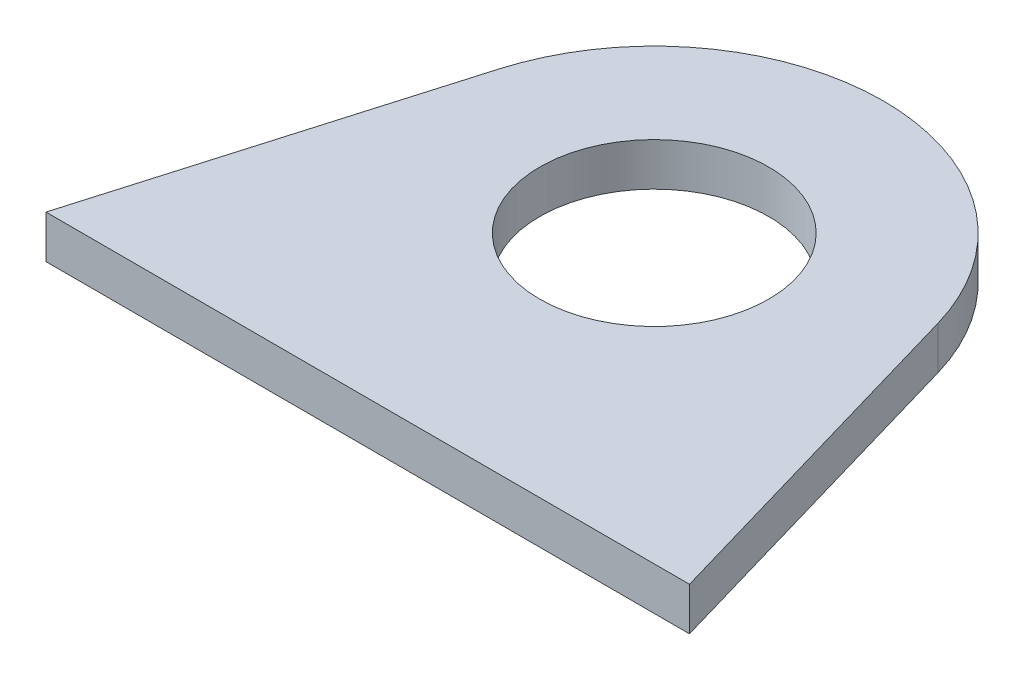
ISO-10303-21;
HEADER;
FILE_DESCRIPTION(('STEP AP214'),'2;1');
FILE_NAME('part.step','',(''),(''),'','','');
FILE_SCHEMA(('AUTOMOTIVE_DESIGN { 1 0 10303 214 1 1 1 1 }'));
ENDSEC;
DATA;
#1=APPLICATION_CONTEXT('core data for automotive mechanical design processes');
#2=APPLICATION_PROTOCOL_DEFINITION('international standard','automotive_design',2000,#1);
#3=PRODUCT_CONTEXT('',#1,'mechanical');
#4=PRODUCT('Part','Part','',(#3));
#5=PRODUCT_RELATED_PRODUCT_CATEGORY('part','',(#4));
#6=PRODUCT_DEFINITION_FORMATION('','',#4);
#7=PRODUCT_DEFINITION_CONTEXT('part definition',#1,'design');
#8=PRODUCT_DEFINITION('design','',#6,#7);
#9=PRODUCT_DEFINITION_SHAPE('','',#8);
#10=(LENGTH_UNIT() NAMED_UNIT(*) SI_UNIT(.MILLI.,.METRE.));
#11=(NAMED_UNIT(*) PLANE_ANGLE_UNIT() SI_UNIT($,.RADIAN.));
#12=(NAMED_UNIT(*) SI_UNIT($,.STERADIAN.) SOLID_ANGLE_UNIT());
#13=UNCERTAINTY_MEASURE_WITH_UNIT(LENGTH_MEASURE(1.E-05),#10,'distance_accuracy_value','');
#14=(GEOMETRIC_REPRESENTATION_CONTEXT(3) GLOBAL_UNCERTAINTY_ASSIGNED_CONTEXT((#13)) GLOBAL_UNIT_ASSIGNED_CONTEXT((#10,
#11,#12)) REPRESENTATION_CONTEXT('',''));
#15=CARTESIAN_POINT('',(0.,0.,0.));
#16=DIRECTION('',(0.,0.,1.));
#17=DIRECTION('',(1.,0.,0.));
#18=AXIS2_PLACEMENT_3D('',#15,#16,#17);
#19=CARTESIAN_POINT('',(0.,6.,0.));
#20=DIRECTION('',(0.,1.,0.));
#21=DIRECTION('',(0.,0.,1.));
#22=AXIS2_PLACEMENT_3D('',#19,#20,#21);
#23=PLANE('',#22);
#24=CARTESIAN_POINT('',(0.,6.,0.));
#25=DIRECTION('',(0.,1.,0.));
#26=DIRECTION('',(0.,0.,1.));
#27=AXIS2_PLACEMENT_3D('',#24,#25,#26);
#28=CIRCLE('',#27,32.);
#29=CARTESIAN_POINT('',(30.7282480533916,6.,-8.93167238367135));
#30=VERTEX_POINT('',#29);
#31=CARTESIAN_POINT('',(-30.7117193547959,6.,-8.98834213146447));
#32=VERTEX_POINT('',#31);
#33=EDGE_CURVE('E98',#30,#32,#28,.T.);
#34=ORIENTED_EDGE('',*,*,#33,.T.);
#35=DIRECTION('',(-0.280885691608264,0.,0.95974122983737));
#36=VECTOR('',#35,1.);
#37=CARTESIAN_POINT('',(-30.7117193547959,6.,-8.98834213146447));
#38=LINE('',#37,#36);
#39=CARTESIAN_POINT('',(-45.0368943709301,6.,39.9584768001118));
#40=VERTEX_POINT('',#39);
#41=EDGE_CURVE('E93',#32,#40,#38,.T.);
#42=ORIENTED_EDGE('',*,*,#41,.T.);
#43=DIRECTION('',(0.999999574626595,0.,0.000922359273253386));
#44=VECTOR('',#43,1.);
#45=CARTESIAN_POINT('',(-45.0368943709301,6.,39.9584768001118));
#46=LINE('',#45,#44);
#47=CARTESIAN_POINT('',(44.9631056290699,6.,40.0414891700158));
#48=VERTEX_POINT('',#47);
#49=EDGE_CURVE('E96',#40,#48,#46,.T.);
#50=ORIENTED_EDGE('',*,*,#49,.T.);
#51=DIRECTION('',(-0.279114761989729,0.,-0.960257751668487));
#52=VECTOR('',#51,1.);
#53=CARTESIAN_POINT('',(44.9631056290699,6.,40.0414891700158));
#54=LINE('',#53,#52);
#55=EDGE_CURVE('E63',#48,#30,#54,.T.);
#56=ORIENTED_EDGE('',*,*,#55,.T.);
#57=EDGE_LOOP('',(#34,#42,#50,#56));
#58=FACE_BOUND('',#57,.T.);
#59=CARTESIAN_POINT('',(0.,6.,0.));
#60=DIRECTION('',(0.,1.,0.));
#61=DIRECTION('',(0.,0.,1.));
#62=AXIS2_PLACEMENT_3D('',#59,#60,#61);
#63=CIRCLE('',#62,16.);
#64=CARTESIAN_POINT('',(0.,6.,16.));
#65=VERTEX_POINT('',#64);
#66=EDGE_CURVE('E118',#65,#65,#63,.T.);
#67=ORIENTED_EDGE('',*,*,#66,.F.);
#68=EDGE_LOOP('',(#67));
#69=FACE_BOUND('',#68,.T.);
#70=ADVANCED_FACE('F45',(#58,#69),#23,.T.);
#71=CARTESIAN_POINT('',(0.,0.,0.));
#72=DIRECTION('',(0.,1.,0.));
#73=DIRECTION('',(0.,0.,1.));
#74=AXIS2_PLACEMENT_3D('',#71,#72,#73);
#75=PLANE('',#74);
#76=CARTESIAN_POINT('',(0.,0.,0.));
#77=DIRECTION('',(0.,1.,0.));
#78=DIRECTION('',(0.,0.,1.));
#79=AXIS2_PLACEMENT_3D('',#76,#77,#78);
#80=CIRCLE('',#79,32.);
#81=CARTESIAN_POINT('',(30.7282480533916,0.,-8.93167238367135));
#82=VERTEX_POINT('',#81);
#83=CARTESIAN_POINT('',(-30.7117193547959,0.,-8.98834213146447));
#84=VERTEX_POINT('',#83);
#85=EDGE_CURVE('E114',#82,#84,#80,.T.);
#86=ORIENTED_EDGE('',*,*,#85,.F.);
#87=DIRECTION('',(-0.279114761989729,0.,-0.960257751668487));
#88=VECTOR('',#87,1.);
#89=CARTESIAN_POINT('',(44.9631056290699,0.,40.0414891700158));
#90=LINE('',#89,#88);
#91=CARTESIAN_POINT('',(44.9631056290699,0.,40.0414891700158));
#92=VERTEX_POINT('',#91);
#93=EDGE_CURVE('E86',#92,#82,#90,.T.);
#94=ORIENTED_EDGE('',*,*,#93,.F.);
#95=DIRECTION('',(0.999999574626595,0.,0.000922359273253386));
#96=VECTOR('',#95,1.);
#97=CARTESIAN_POINT('',(-45.0368943709301,0.,39.9584768001118));
#98=LINE('',#97,#96);
#99=CARTESIAN_POINT('',(-45.0368943709301,0.,39.9584768001118));
#100=VERTEX_POINT('',#99);
#101=EDGE_CURVE('E80',#100,#92,#98,.T.);
#102=ORIENTED_EDGE('',*,*,#101,.F.);
#103=DIRECTION('',(-0.280885691608264,0.,0.95974122983737));
#104=VECTOR('',#103,1.);
#105=CARTESIAN_POINT('',(-30.7117193547959,0.,-8.98834213146447));
#106=LINE('',#105,#104);
#107=EDGE_CURVE('E103',#84,#100,#106,.T.);
#108=ORIENTED_EDGE('',*,*,#107,.F.);
#109=EDGE_LOOP('',(#86,#94,#102,#108));
#110=FACE_BOUND('',#109,.T.);
#111=CARTESIAN_POINT('',(0.,0.,0.));
#112=DIRECTION('',(0.,1.,0.));
#113=DIRECTION('',(0.,0.,1.));
#114=AXIS2_PLACEMENT_3D('',#111,#112,#113);
#115=CIRCLE('',#114,16.);
#116=CARTESIAN_POINT('',(0.,0.,16.));
#117=VERTEX_POINT('',#116);
#118=EDGE_CURVE('E136',#117,#117,#115,.T.);
#119=ORIENTED_EDGE('',*,*,#118,.T.);
#120=EDGE_LOOP('',(#119));
#121=FACE_BOUND('',#120,.T.);
#122=ADVANCED_FACE('F131',(#110,#121),#75,.F.);
#123=CARTESIAN_POINT('',(0.,6.,0.));
#124=DIRECTION('',(0.,-1.,0.));
#125=DIRECTION('',(0.,0.,-1.));
#126=AXIS2_PLACEMENT_3D('',#123,#124,#125);
#127=CYLINDRICAL_SURFACE('',#126,32.);
#128=ORIENTED_EDGE('',*,*,#85,.T.);
#129=DIRECTION('',(0.,-1.,0.));
#130=VECTOR('',#129,1.);
#131=CARTESIAN_POINT('',(-30.7117193547959,6.,-8.98834213146447));
#132=LINE('',#131,#130);
#133=EDGE_CURVE('E11',#32,#84,#132,.T.);
#134=ORIENTED_EDGE('',*,*,#133,.F.);
#135=ORIENTED_EDGE('',*,*,#33,.F.);
#136=DIRECTION('',(0.,-1.,0.));
#137=VECTOR('',#136,1.);
#138=CARTESIAN_POINT('',(30.7282480533916,6.,-8.93167238367135));
#139=LINE('',#138,#137);
#140=EDGE_CURVE('E110',#30,#82,#139,.T.);
#141=ORIENTED_EDGE('',*,*,#140,.T.);
#142=EDGE_LOOP('',(#128,#134,#135,#141));
#143=FACE_BOUND('',#142,.T.);
#144=ADVANCED_FACE('F47',(#143),#127,.T.);
#145=CARTESIAN_POINT('',(-30.7117193547959,6.,-8.98834213146447));
#146=DIRECTION('',(0.95974122983737,0.,0.280885691608264));
#147=DIRECTION('',(0.280885691608264,0.,-0.95974122983737));
#148=AXIS2_PLACEMENT_3D('',#145,#146,#147);
#149=PLANE('',#148);
#150=ORIENTED_EDGE('',*,*,#107,.T.);
#151=DIRECTION('',(0.,-1.,0.));
#152=VECTOR('',#151,1.);
#153=CARTESIAN_POINT('',(-45.0368943709301,6.,39.9584768001118));
#154=LINE('',#153,#152);
#155=EDGE_CURVE('E55',#40,#100,#154,.T.);
#156=ORIENTED_EDGE('',*,*,#155,.F.);
#157=ORIENTED_EDGE('',*,*,#41,.F.);
#158=ORIENTED_EDGE('',*,*,#133,.T.);
#159=EDGE_LOOP('',(#150,#156,#157,#158));
#160=FACE_BOUND('',#159,.T.);
#161=ADVANCED_FACE('F102',(#160),#149,.F.);
#162=CARTESIAN_POINT('',(-45.0368943709301,6.,39.9584768001118));
#163=DIRECTION('',(0.000922359273253386,0.,-0.999999574626595));
#164=DIRECTION('',(-0.999999574626595,0.,-0.000922359273253386));
#165=AXIS2_PLACEMENT_3D('',#162,#163,#164);
#166=PLANE('',#165);
#167=ORIENTED_EDGE('',*,*,#101,.T.);
#168=DIRECTION('',(0.,-1.,0.));
#169=VECTOR('',#168,1.);
#170=CARTESIAN_POINT('',(44.9631056290699,6.,40.0414891700158));
#171=LINE('',#170,#169);
#172=EDGE_CURVE('E105',#48,#92,#171,.T.);
#173=ORIENTED_EDGE('',*,*,#172,.F.);
#174=ORIENTED_EDGE('',*,*,#49,.F.);
#175=ORIENTED_EDGE('',*,*,#155,.T.);
#176=EDGE_LOOP('',(#167,#173,#174,#175));
#177=FACE_BOUND('',#176,.T.);
#178=ADVANCED_FACE('F106',(#177),#166,.F.);
#179=CARTESIAN_POINT('',(44.9631056290699,6.,40.0414891700158));
#180=DIRECTION('',(-0.960257751668486,0.,0.279114761989729));
#181=DIRECTION('',(0.279114761989729,0.,0.960257751668487));
#182=AXIS2_PLACEMENT_3D('',#179,#180,#181);
#183=PLANE('',#182);
#184=ORIENTED_EDGE('',*,*,#93,.T.);
#185=ORIENTED_EDGE('',*,*,#140,.F.);
#186=ORIENTED_EDGE('',*,*,#55,.F.);
#187=ORIENTED_EDGE('',*,*,#172,.T.);
#188=EDGE_LOOP('',(#184,#185,#186,#187));
#189=FACE_BOUND('',#188,.T.);
#190=ADVANCED_FACE('F128',(#189),#183,.F.);
#191=CARTESIAN_POINT('',(0.,6.,0.));
#192=DIRECTION('',(0.,-1.,0.));
#193=DIRECTION('',(0.,0.,-1.));
#194=AXIS2_PLACEMENT_3D('',#191,#192,#193);
#195=CYLINDRICAL_SURFACE('',#194,16.);
#196=ORIENTED_EDGE('',*,*,#66,.T.);
#197=EDGE_LOOP('',(#196));
#198=FACE_BOUND('',#197,.T.);
#199=ORIENTED_EDGE('',*,*,#118,.F.);
#200=EDGE_LOOP('',(#199));
#201=FACE_BOUND('',#200,.T.);
#202=ADVANCED_FACE('F144',(#198,#201),#195,.F.);
#203=CLOSED_SHELL('',(#70,#122,#144,#161,#178,#190,#202));
#204=MANIFOLD_SOLID_BREP('B2',#203);
#205=ADVANCED_BREP_SHAPE_REPRESENTATION('',(#18,#204),#14);
#206=SHAPE_DEFINITION_REPRESENTATION(#9,#205);
ENDSEC;
END-ISO-10303-21;
